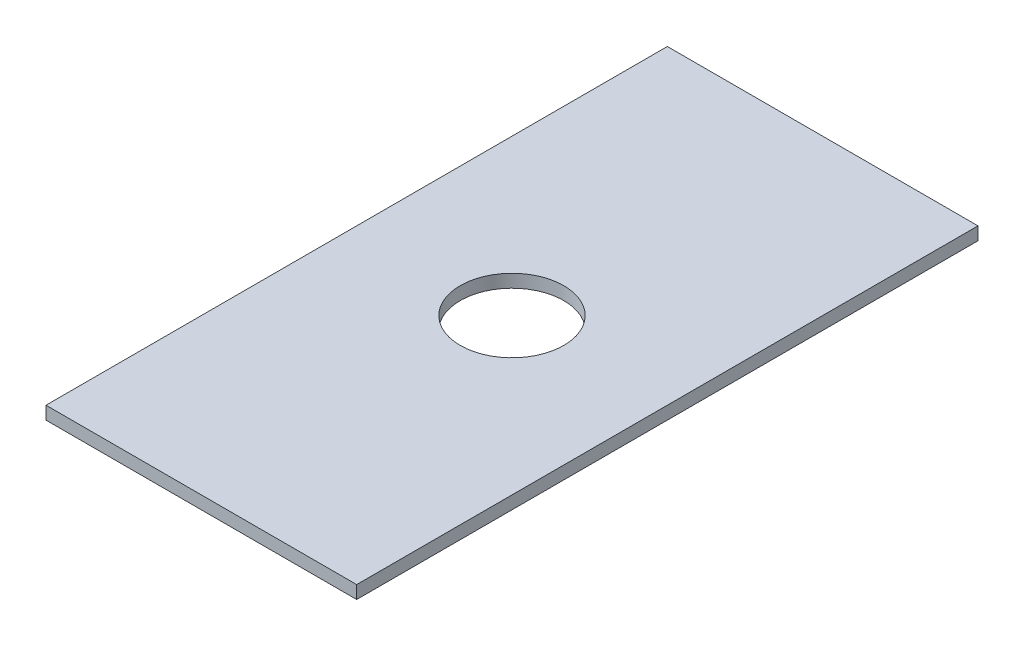
ISO-10303-21;
HEADER;
FILE_DESCRIPTION(('STEP AP214'),'2;1');
FILE_NAME('part.step','',(''),(''),'','','');
FILE_SCHEMA(('AUTOMOTIVE_DESIGN { 1 0 10303 214 1 1 1 1 }'));
ENDSEC;
DATA;
#1=APPLICATION_CONTEXT('core data for automotive mechanical design processes');
#2=APPLICATION_PROTOCOL_DEFINITION('international standard','automotive_design',2000,#1);
#3=PRODUCT_CONTEXT('',#1,'mechanical');
#4=PRODUCT('Part','Part','',(#3));
#5=PRODUCT_RELATED_PRODUCT_CATEGORY('part','',(#4));
#6=PRODUCT_DEFINITION_FORMATION('','',#4);
#7=PRODUCT_DEFINITION_CONTEXT('part definition',#1,'design');
#8=PRODUCT_DEFINITION('design','',#6,#7);
#9=PRODUCT_DEFINITION_SHAPE('','',#8);
#10=(LENGTH_UNIT() NAMED_UNIT(*) SI_UNIT(.MILLI.,.METRE.));
#11=(NAMED_UNIT(*) PLANE_ANGLE_UNIT() SI_UNIT($,.RADIAN.));
#12=(NAMED_UNIT(*) SI_UNIT($,.STERADIAN.) SOLID_ANGLE_UNIT());
#13=UNCERTAINTY_MEASURE_WITH_UNIT(LENGTH_MEASURE(1.E-05),#10,'distance_accuracy_value','');
#14=(GEOMETRIC_REPRESENTATION_CONTEXT(3) GLOBAL_UNCERTAINTY_ASSIGNED_CONTEXT((#13)) GLOBAL_UNIT_ASSIGNED_CONTEXT((#10,
#11,#12)) REPRESENTATION_CONTEXT('',''));
#15=CARTESIAN_POINT('',(0.,0.,0.));
#16=DIRECTION('',(0.,0.,1.));
#17=DIRECTION('',(1.,0.,0.));
#18=AXIS2_PLACEMENT_3D('',#15,#16,#17);
#19=CARTESIAN_POINT('',(0.,3.175,0.));
#20=DIRECTION('',(0.,-1.,0.));
#21=DIRECTION('',(0.,0.,-1.));
#22=AXIS2_PLACEMENT_3D('',#19,#20,#21);
#23=PLANE('',#22);
#24=DIRECTION('',(0.,0.,-1.));
#25=VECTOR('',#24,1.);
#26=CARTESIAN_POINT('',(38.1,3.175,76.2));
#27=LINE('',#26,#25);
#28=CARTESIAN_POINT('',(38.1,3.175,76.2));
#29=VERTEX_POINT('',#28);
#30=CARTESIAN_POINT('',(38.1,3.175,-76.2));
#31=VERTEX_POINT('',#30);
#32=EDGE_CURVE('E87',#29,#31,#27,.T.);
#33=ORIENTED_EDGE('',*,*,#32,.T.);
#34=DIRECTION('',(-1.,0.,0.));
#35=VECTOR('',#34,1.);
#36=CARTESIAN_POINT('',(-38.1,3.175,-76.2));
#37=LINE('',#36,#35);
#38=CARTESIAN_POINT('',(-38.1,3.175,-76.2));
#39=VERTEX_POINT('',#38);
#40=EDGE_CURVE('E82',#31,#39,#37,.T.);
#41=ORIENTED_EDGE('',*,*,#40,.T.);
#42=DIRECTION('',(0.,0.,1.));
#43=VECTOR('',#42,1.);
#44=CARTESIAN_POINT('',(-38.1,3.175,76.2));
#45=LINE('',#44,#43);
#46=CARTESIAN_POINT('',(-38.1,3.175,76.2));
#47=VERTEX_POINT('',#46);
#48=EDGE_CURVE('E85',#39,#47,#45,.T.);
#49=ORIENTED_EDGE('',*,*,#48,.T.);
#50=DIRECTION('',(1.,0.,0.));
#51=VECTOR('',#50,1.);
#52=CARTESIAN_POINT('',(-38.1,3.175,76.2));
#53=LINE('',#52,#51);
#54=EDGE_CURVE('E52',#47,#29,#53,.T.);
#55=ORIENTED_EDGE('',*,*,#54,.T.);
#56=EDGE_LOOP('',(#33,#41,#49,#55));
#57=FACE_BOUND('',#56,.T.);
#58=CARTESIAN_POINT('',(0.,3.175,0.));
#59=DIRECTION('',(0.,1.,0.));
#60=DIRECTION('',(0.,0.,1.));
#61=AXIS2_PLACEMENT_3D('',#58,#59,#60);
#62=CIRCLE('',#61,12.7);
#63=CARTESIAN_POINT('',(0.,3.175,12.7000000000001));
#64=VERTEX_POINT('',#63);
#65=EDGE_CURVE('E102',#64,#64,#62,.T.);
#66=ORIENTED_EDGE('',*,*,#65,.F.);
#67=EDGE_LOOP('',(#66));
#68=FACE_BOUND('',#67,.T.);
#69=ADVANCED_FACE('F35',(#57,#68),#23,.F.);
#70=CARTESIAN_POINT('',(0.,0.,0.));
#71=DIRECTION('',(0.,-1.,0.));
#72=DIRECTION('',(0.,0.,-1.));
#73=AXIS2_PLACEMENT_3D('',#70,#71,#72);
#74=PLANE('',#73);
#75=DIRECTION('',(0.,0.,-1.));
#76=VECTOR('',#75,1.);
#77=CARTESIAN_POINT('',(38.1,0.,76.2));
#78=LINE('',#77,#76);
#79=CARTESIAN_POINT('',(38.1,0.,76.2));
#80=VERTEX_POINT('',#79);
#81=CARTESIAN_POINT('',(38.1,0.,-76.2));
#82=VERTEX_POINT('',#81);
#83=EDGE_CURVE('E99',#80,#82,#78,.T.);
#84=ORIENTED_EDGE('',*,*,#83,.F.);
#85=DIRECTION('',(1.,0.,0.));
#86=VECTOR('',#85,1.);
#87=CARTESIAN_POINT('',(-38.1,0.,76.2));
#88=LINE('',#87,#86);
#89=CARTESIAN_POINT('',(-38.1,0.,76.2));
#90=VERTEX_POINT('',#89);
#91=EDGE_CURVE('E75',#90,#80,#88,.T.);
#92=ORIENTED_EDGE('',*,*,#91,.F.);
#93=DIRECTION('',(0.,0.,1.));
#94=VECTOR('',#93,1.);
#95=CARTESIAN_POINT('',(-38.1,0.,76.2));
#96=LINE('',#95,#94);
#97=CARTESIAN_POINT('',(-38.1,0.,-76.2));
#98=VERTEX_POINT('',#97);
#99=EDGE_CURVE('E69',#98,#90,#96,.T.);
#100=ORIENTED_EDGE('',*,*,#99,.F.);
#101=DIRECTION('',(-1.,0.,0.));
#102=VECTOR('',#101,1.);
#103=CARTESIAN_POINT('',(-38.1,0.,-76.2));
#104=LINE('',#103,#102);
#105=EDGE_CURVE('E91',#82,#98,#104,.T.);
#106=ORIENTED_EDGE('',*,*,#105,.F.);
#107=EDGE_LOOP('',(#84,#92,#100,#106));
#108=FACE_BOUND('',#107,.T.);
#109=CARTESIAN_POINT('',(0.,0.,0.));
#110=DIRECTION('',(0.,1.,0.));
#111=DIRECTION('',(0.,0.,1.));
#112=AXIS2_PLACEMENT_3D('',#109,#110,#111);
#113=CIRCLE('',#112,12.7);
#114=CARTESIAN_POINT('',(0.,0.,12.7000000000001));
#115=VERTEX_POINT('',#114);
#116=EDGE_CURVE('E114',#115,#115,#113,.T.);
#117=ORIENTED_EDGE('',*,*,#116,.T.);
#118=EDGE_LOOP('',(#117));
#119=FACE_BOUND('',#118,.T.);
#120=ADVANCED_FACE('F110',(#108,#119),#74,.T.);
#121=CARTESIAN_POINT('',(38.1,3.175,76.2));
#122=DIRECTION('',(-1.,0.,0.));
#123=DIRECTION('',(0.,0.,1.));
#124=AXIS2_PLACEMENT_3D('',#121,#122,#123);
#125=PLANE('',#124);
#126=ORIENTED_EDGE('',*,*,#83,.T.);
#127=DIRECTION('',(0.,-1.,0.));
#128=VECTOR('',#127,1.);
#129=CARTESIAN_POINT('',(38.1,3.175,-76.2));
#130=LINE('',#129,#128);
#131=EDGE_CURVE('E11',#31,#82,#130,.T.);
#132=ORIENTED_EDGE('',*,*,#131,.F.);
#133=ORIENTED_EDGE('',*,*,#32,.F.);
#134=DIRECTION('',(0.,-1.,0.));
#135=VECTOR('',#134,1.);
#136=CARTESIAN_POINT('',(38.1,3.175,76.2));
#137=LINE('',#136,#135);
#138=EDGE_CURVE('E95',#29,#80,#137,.T.);
#139=ORIENTED_EDGE('',*,*,#138,.T.);
#140=EDGE_LOOP('',(#126,#132,#133,#139));
#141=FACE_BOUND('',#140,.T.);
#142=ADVANCED_FACE('F37',(#141),#125,.F.);
#143=CARTESIAN_POINT('',(-38.1,3.175,-76.2));
#144=DIRECTION('',(0.,0.,1.));
#145=DIRECTION('',(1.,0.,0.));
#146=AXIS2_PLACEMENT_3D('',#143,#144,#145);
#147=PLANE('',#146);
#148=ORIENTED_EDGE('',*,*,#105,.T.);
#149=DIRECTION('',(0.,-1.,0.));
#150=VECTOR('',#149,1.);
#151=CARTESIAN_POINT('',(-38.1,3.175,-76.2));
#152=LINE('',#151,#150);
#153=EDGE_CURVE('E44',#39,#98,#152,.T.);
#154=ORIENTED_EDGE('',*,*,#153,.F.);
#155=ORIENTED_EDGE('',*,*,#40,.F.);
#156=ORIENTED_EDGE('',*,*,#131,.T.);
#157=EDGE_LOOP('',(#148,#154,#155,#156));
#158=FACE_BOUND('',#157,.T.);
#159=ADVANCED_FACE('F90',(#158),#147,.F.);
#160=CARTESIAN_POINT('',(-38.1,3.175,76.2));
#161=DIRECTION('',(1.,0.,0.));
#162=DIRECTION('',(0.,0.,-1.));
#163=AXIS2_PLACEMENT_3D('',#160,#161,#162);
#164=PLANE('',#163);
#165=ORIENTED_EDGE('',*,*,#99,.T.);
#166=DIRECTION('',(0.,-1.,0.));
#167=VECTOR('',#166,1.);
#168=CARTESIAN_POINT('',(-38.1,3.175,76.2));
#169=LINE('',#168,#167);
#170=EDGE_CURVE('E92',#47,#90,#169,.T.);
#171=ORIENTED_EDGE('',*,*,#170,.F.);
#172=ORIENTED_EDGE('',*,*,#48,.F.);
#173=ORIENTED_EDGE('',*,*,#153,.T.);
#174=EDGE_LOOP('',(#165,#171,#172,#173));
#175=FACE_BOUND('',#174,.T.);
#176=ADVANCED_FACE('F93',(#175),#164,.F.);
#177=CARTESIAN_POINT('',(-38.1,3.175,76.2));
#178=DIRECTION('',(0.,0.,-1.));
#179=DIRECTION('',(-1.,0.,0.));
#180=AXIS2_PLACEMENT_3D('',#177,#178,#179);
#181=PLANE('',#180);
#182=ORIENTED_EDGE('',*,*,#91,.T.);
#183=ORIENTED_EDGE('',*,*,#138,.F.);
#184=ORIENTED_EDGE('',*,*,#54,.F.);
#185=ORIENTED_EDGE('',*,*,#170,.T.);
#186=EDGE_LOOP('',(#182,#183,#184,#185));
#187=FACE_BOUND('',#186,.T.);
#188=ADVANCED_FACE('F107',(#187),#181,.F.);
#189=CARTESIAN_POINT('',(0.,3.175,0.));
#190=DIRECTION('',(0.,-1.,0.));
#191=DIRECTION('',(0.,0.,-1.));
#192=AXIS2_PLACEMENT_3D('',#189,#190,#191);
#193=CYLINDRICAL_SURFACE('',#192,12.7);
#194=ORIENTED_EDGE('',*,*,#65,.T.);
#195=EDGE_LOOP('',(#194));
#196=FACE_BOUND('',#195,.T.);
#197=ORIENTED_EDGE('',*,*,#116,.F.);
#198=EDGE_LOOP('',(#197));
#199=FACE_BOUND('',#198,.T.);
#200=ADVANCED_FACE('F120',(#196,#199),#193,.F.);
#201=CLOSED_SHELL('',(#69,#120,#142,#159,#176,#188,#200));
#202=MANIFOLD_SOLID_BREP('B2',#201);
#203=ADVANCED_BREP_SHAPE_REPRESENTATION('',(#18,#202),#14);
#204=SHAPE_DEFINITION_REPRESENTATION(#9,#203);
ENDSEC;
END-ISO-10303-21;
